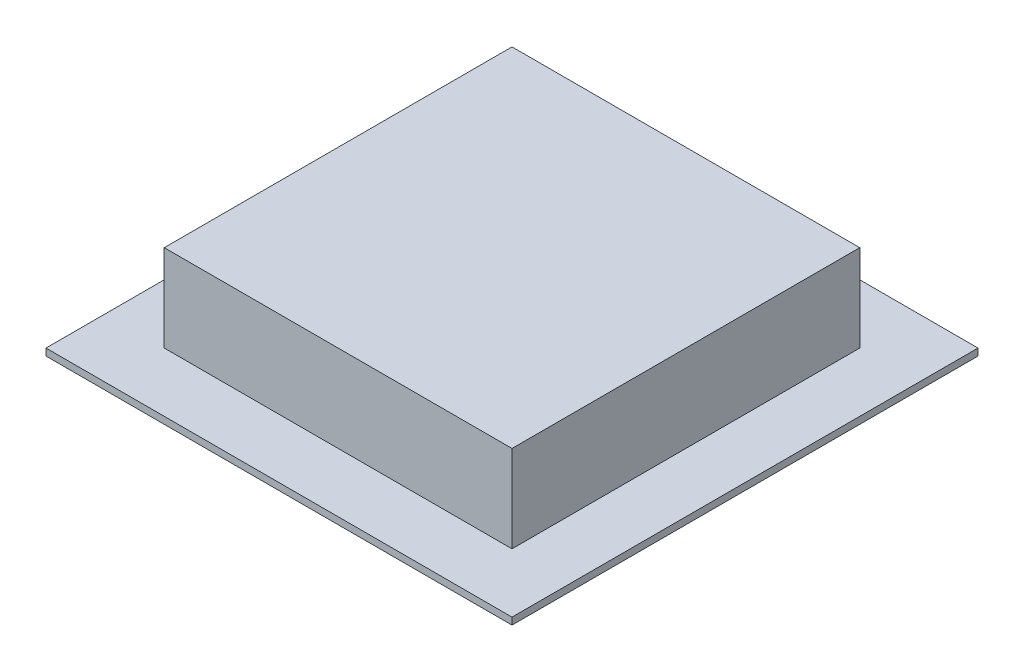
ISO-10303-21;
HEADER;
FILE_DESCRIPTION(('STEP AP214'),'2;1');
FILE_NAME('part.step','',(''),(''),'','','');
FILE_SCHEMA(('AUTOMOTIVE_DESIGN { 1 0 10303 214 1 1 1 1 }'));
ENDSEC;
DATA;
#1=APPLICATION_CONTEXT('core data for automotive mechanical design processes');
#2=APPLICATION_PROTOCOL_DEFINITION('international standard','automotive_design',2000,#1);
#3=PRODUCT_CONTEXT('',#1,'mechanical');
#4=PRODUCT('Part','Part','',(#3));
#5=PRODUCT_RELATED_PRODUCT_CATEGORY('part','',(#4));
#6=PRODUCT_DEFINITION_FORMATION('','',#4);
#7=PRODUCT_DEFINITION_CONTEXT('part definition',#1,'design');
#8=PRODUCT_DEFINITION('design','',#6,#7);
#9=PRODUCT_DEFINITION_SHAPE('','',#8);
#10=(LENGTH_UNIT() NAMED_UNIT(*) SI_UNIT(.MILLI.,.METRE.));
#11=(NAMED_UNIT(*) PLANE_ANGLE_UNIT() SI_UNIT($,.RADIAN.));
#12=(NAMED_UNIT(*) SI_UNIT($,.STERADIAN.) SOLID_ANGLE_UNIT());
#13=UNCERTAINTY_MEASURE_WITH_UNIT(LENGTH_MEASURE(1.E-05),#10,'distance_accuracy_value','');
#14=(GEOMETRIC_REPRESENTATION_CONTEXT(3) GLOBAL_UNCERTAINTY_ASSIGNED_CONTEXT((#13)) GLOBAL_UNIT_ASSIGNED_CONTEXT((#10,
#11,#12)) REPRESENTATION_CONTEXT('',''));
#15=CARTESIAN_POINT('',(0.,0.,0.));
#16=DIRECTION('',(0.,0.,1.));
#17=DIRECTION('',(1.,0.,0.));
#18=AXIS2_PLACEMENT_3D('',#15,#16,#17);
#19=CARTESIAN_POINT('',(-85.09,2.54,-85.09));
#20=DIRECTION('',(1.,0.,0.));
#21=DIRECTION('',(0.,0.,-1.));
#22=AXIS2_PLACEMENT_3D('',#19,#20,#21);
#23=PLANE('',#22);
#24=DIRECTION('',(0.,0.,1.));
#25=VECTOR('',#24,1.);
#26=CARTESIAN_POINT('',(-85.09,0.,-85.09));
#27=LINE('',#26,#25);
#28=CARTESIAN_POINT('',(-85.09,0.,-85.09));
#29=VERTEX_POINT('',#28);
#30=CARTESIAN_POINT('',(-85.09,0.,85.09));
#31=VERTEX_POINT('',#30);
#32=EDGE_CURVE('E126',#29,#31,#27,.T.);
#33=ORIENTED_EDGE('',*,*,#32,.T.);
#34=DIRECTION('',(0.,-1.,0.));
#35=VECTOR('',#34,1.);
#36=CARTESIAN_POINT('',(-85.09,2.54,85.09));
#37=LINE('',#36,#35);
#38=CARTESIAN_POINT('',(-85.09,2.54,85.09));
#39=VERTEX_POINT('',#38);
#40=EDGE_CURVE('E11',#39,#31,#37,.T.);
#41=ORIENTED_EDGE('',*,*,#40,.F.);
#42=DIRECTION('',(0.,0.,1.));
#43=VECTOR('',#42,1.);
#44=CARTESIAN_POINT('',(-85.09,2.54,-85.09));
#45=LINE('',#44,#43);
#46=CARTESIAN_POINT('',(-85.09,2.54,-85.09));
#47=VERTEX_POINT('',#46);
#48=EDGE_CURVE('E137',#47,#39,#45,.T.);
#49=ORIENTED_EDGE('',*,*,#48,.F.);
#50=DIRECTION('',(0.,-1.,0.));
#51=VECTOR('',#50,1.);
#52=CARTESIAN_POINT('',(-85.09,2.54,-85.09));
#53=LINE('',#52,#51);
#54=EDGE_CURVE('E150',#47,#29,#53,.T.);
#55=ORIENTED_EDGE('',*,*,#54,.T.);
#56=EDGE_LOOP('',(#33,#41,#49,#55));
#57=FACE_BOUND('',#56,.T.);
#58=ADVANCED_FACE('F38',(#57),#23,.F.);
#59=CARTESIAN_POINT('',(-85.09,2.54,85.09));
#60=DIRECTION('',(0.,0.,-1.));
#61=DIRECTION('',(-1.,0.,0.));
#62=AXIS2_PLACEMENT_3D('',#59,#60,#61);
#63=PLANE('',#62);
#64=DIRECTION('',(1.,0.,0.));
#65=VECTOR('',#64,1.);
#66=CARTESIAN_POINT('',(-85.09,0.,85.09));
#67=LINE('',#66,#65);
#68=CARTESIAN_POINT('',(85.09,0.,85.09));
#69=VERTEX_POINT('',#68);
#70=EDGE_CURVE('E131',#31,#69,#67,.T.);
#71=ORIENTED_EDGE('',*,*,#70,.T.);
#72=DIRECTION('',(0.,-1.,0.));
#73=VECTOR('',#72,1.);
#74=CARTESIAN_POINT('',(85.09,2.54,85.09));
#75=LINE('',#74,#73);
#76=CARTESIAN_POINT('',(85.09,2.54,85.09));
#77=VERTEX_POINT('',#76);
#78=EDGE_CURVE('E46',#77,#69,#75,.T.);
#79=ORIENTED_EDGE('',*,*,#78,.F.);
#80=DIRECTION('',(1.,0.,0.));
#81=VECTOR('',#80,1.);
#82=CARTESIAN_POINT('',(-85.09,2.54,85.09));
#83=LINE('',#82,#81);
#84=EDGE_CURVE('E141',#39,#77,#83,.T.);
#85=ORIENTED_EDGE('',*,*,#84,.F.);
#86=ORIENTED_EDGE('',*,*,#40,.T.);
#87=EDGE_LOOP('',(#71,#79,#85,#86));
#88=FACE_BOUND('',#87,.T.);
#89=ADVANCED_FACE('F187',(#88),#63,.F.);
#90=CARTESIAN_POINT('',(85.09,2.54,-85.09));
#91=DIRECTION('',(-1.,0.,0.));
#92=DIRECTION('',(0.,0.,1.));
#93=AXIS2_PLACEMENT_3D('',#90,#91,#92);
#94=PLANE('',#93);
#95=DIRECTION('',(0.,0.,-1.));
#96=VECTOR('',#95,1.);
#97=CARTESIAN_POINT('',(85.09,0.,-85.09));
#98=LINE('',#97,#96);
#99=CARTESIAN_POINT('',(85.09,0.,-85.09));
#100=VERTEX_POINT('',#99);
#101=EDGE_CURVE('E154',#69,#100,#98,.T.);
#102=ORIENTED_EDGE('',*,*,#101,.T.);
#103=DIRECTION('',(0.,-1.,0.));
#104=VECTOR('',#103,1.);
#105=CARTESIAN_POINT('',(85.09,2.54,-85.09));
#106=LINE('',#105,#104);
#107=CARTESIAN_POINT('',(85.09,2.54,-85.09));
#108=VERTEX_POINT('',#107);
#109=EDGE_CURVE('E162',#108,#100,#106,.T.);
#110=ORIENTED_EDGE('',*,*,#109,.F.);
#111=DIRECTION('',(0.,0.,-1.));
#112=VECTOR('',#111,1.);
#113=CARTESIAN_POINT('',(85.09,2.54,-85.09));
#114=LINE('',#113,#112);
#115=EDGE_CURVE('E145',#77,#108,#114,.T.);
#116=ORIENTED_EDGE('',*,*,#115,.F.);
#117=ORIENTED_EDGE('',*,*,#78,.T.);
#118=EDGE_LOOP('',(#102,#110,#116,#117));
#119=FACE_BOUND('',#118,.T.);
#120=ADVANCED_FACE('F171',(#119),#94,.F.);
#121=CARTESIAN_POINT('',(-85.09,2.54,-85.09));
#122=DIRECTION('',(0.,0.,1.));
#123=DIRECTION('',(1.,0.,0.));
#124=AXIS2_PLACEMENT_3D('',#121,#122,#123);
#125=PLANE('',#124);
#126=DIRECTION('',(-1.,0.,0.));
#127=VECTOR('',#126,1.);
#128=CARTESIAN_POINT('',(-85.09,0.,-85.09));
#129=LINE('',#128,#127);
#130=EDGE_CURVE('E142',#100,#29,#129,.T.);
#131=ORIENTED_EDGE('',*,*,#130,.T.);
#132=ORIENTED_EDGE('',*,*,#54,.F.);
#133=DIRECTION('',(-1.,0.,0.));
#134=VECTOR('',#133,1.);
#135=CARTESIAN_POINT('',(-85.09,2.54,-85.09));
#136=LINE('',#135,#134);
#137=EDGE_CURVE('E148',#108,#47,#136,.T.);
#138=ORIENTED_EDGE('',*,*,#137,.F.);
#139=ORIENTED_EDGE('',*,*,#109,.T.);
#140=EDGE_LOOP('',(#131,#132,#138,#139));
#141=FACE_BOUND('',#140,.T.);
#142=ADVANCED_FACE('F180',(#141),#125,.F.);
#143=CARTESIAN_POINT('',(0.,2.54,0.));
#144=DIRECTION('',(0.,1.,0.));
#145=DIRECTION('',(0.,0.,1.));
#146=AXIS2_PLACEMENT_3D('',#143,#144,#145);
#147=PLANE('',#146);
#148=CARTESIAN_POINT('',(-80.01,2.54,-78.74));
#149=DIRECTION('',(0.,1.,0.));
#150=DIRECTION('',(0.,0.,1.));
#151=AXIS2_PLACEMENT_3D('',#148,#149,#150);
#152=CIRCLE('',#151,2.);
#153=CARTESIAN_POINT('',(-80.01,2.54,-76.74));
#154=VERTEX_POINT('',#153);
#155=EDGE_CURVE('E225',#154,#154,#152,.T.);
#156=ORIENTED_EDGE('',*,*,#155,.F.);
#157=EDGE_LOOP('',(#156));
#158=FACE_BOUND('',#157,.T.);
#159=DIRECTION('',(0.,0.,1.));
#160=VECTOR('',#159,1.);
#161=CARTESIAN_POINT('',(-63.5,2.54,-63.5));
#162=LINE('',#161,#160);
#163=CARTESIAN_POINT('',(-63.5,2.54,-63.5));
#164=VERTEX_POINT('',#163);
#165=CARTESIAN_POINT('',(-63.5,2.54,63.5));
#166=VERTEX_POINT('',#165);
#167=EDGE_CURVE('E53',#164,#166,#162,.T.);
#168=ORIENTED_EDGE('',*,*,#167,.F.);
#169=DIRECTION('',(-1.,0.,0.));
#170=VECTOR('',#169,1.);
#171=CARTESIAN_POINT('',(-63.5,2.54,-63.5));
#172=LINE('',#171,#170);
#173=CARTESIAN_POINT('',(63.5,2.54,-63.5));
#174=VERTEX_POINT('',#173);
#175=EDGE_CURVE('E57',#174,#164,#172,.T.);
#176=ORIENTED_EDGE('',*,*,#175,.F.);
#177=DIRECTION('',(0.,0.,-1.));
#178=VECTOR('',#177,1.);
#179=CARTESIAN_POINT('',(63.5,2.54,-63.5));
#180=LINE('',#179,#178);
#181=CARTESIAN_POINT('',(63.5,2.54,63.5));
#182=VERTEX_POINT('',#181);
#183=EDGE_CURVE('E244',#182,#174,#180,.T.);
#184=ORIENTED_EDGE('',*,*,#183,.F.);
#185=DIRECTION('',(1.,0.,0.));
#186=VECTOR('',#185,1.);
#187=CARTESIAN_POINT('',(-63.5,2.54,63.5));
#188=LINE('',#187,#186);
#189=EDGE_CURVE('E233',#166,#182,#188,.T.);
#190=ORIENTED_EDGE('',*,*,#189,.F.);
#191=EDGE_LOOP('',(#168,#176,#184,#190));
#192=FACE_BOUND('',#191,.T.);
#193=ORIENTED_EDGE('',*,*,#48,.T.);
#194=ORIENTED_EDGE('',*,*,#84,.T.);
#195=ORIENTED_EDGE('',*,*,#115,.T.);
#196=ORIENTED_EDGE('',*,*,#137,.T.);
#197=EDGE_LOOP('',(#193,#194,#195,#196));
#198=FACE_BOUND('',#197,.T.);
#199=ADVANCED_FACE('F186',(#158,#192,#198),#147,.T.);
#200=CARTESIAN_POINT('',(0.,0.,0.));
#201=DIRECTION('',(0.,1.,0.));
#202=DIRECTION('',(0.,0.,1.));
#203=AXIS2_PLACEMENT_3D('',#200,#201,#202);
#204=PLANE('',#203);
#205=CARTESIAN_POINT('',(-80.01,0.,-78.74));
#206=DIRECTION('',(0.,1.,0.));
#207=DIRECTION('',(0.,0.,1.));
#208=AXIS2_PLACEMENT_3D('',#205,#206,#207);
#209=CIRCLE('',#208,2.);
#210=CARTESIAN_POINT('',(-80.01,0.,-76.74));
#211=VERTEX_POINT('',#210);
#212=EDGE_CURVE('E228',#211,#211,#209,.T.);
#213=ORIENTED_EDGE('',*,*,#212,.T.);
#214=EDGE_LOOP('',(#213));
#215=FACE_BOUND('',#214,.T.);
#216=ORIENTED_EDGE('',*,*,#32,.F.);
#217=ORIENTED_EDGE('',*,*,#130,.F.);
#218=ORIENTED_EDGE('',*,*,#101,.F.);
#219=ORIENTED_EDGE('',*,*,#70,.F.);
#220=EDGE_LOOP('',(#216,#217,#218,#219));
#221=FACE_BOUND('',#220,.T.);
#222=ADVANCED_FACE('F177',(#215,#221),#204,.F.);
#223=CARTESIAN_POINT('',(-63.5,34.29,-63.5));
#224=DIRECTION('',(1.,0.,0.));
#225=DIRECTION('',(0.,0.,-1.));
#226=AXIS2_PLACEMENT_3D('',#223,#224,#225);
#227=PLANE('',#226);
#228=ORIENTED_EDGE('',*,*,#167,.T.);
#229=DIRECTION('',(0.,-1.,0.));
#230=VECTOR('',#229,1.);
#231=CARTESIAN_POINT('',(-63.5,34.29,63.5));
#232=LINE('',#231,#230);
#233=CARTESIAN_POINT('',(-63.5,34.29,63.5));
#234=VERTEX_POINT('',#233);
#235=EDGE_CURVE('E106',#234,#166,#232,.T.);
#236=ORIENTED_EDGE('',*,*,#235,.F.);
#237=DIRECTION('',(0.,0.,1.));
#238=VECTOR('',#237,1.);
#239=CARTESIAN_POINT('',(-63.5,34.29,-63.5));
#240=LINE('',#239,#238);
#241=CARTESIAN_POINT('',(-63.5,34.29,-63.5));
#242=VERTEX_POINT('',#241);
#243=EDGE_CURVE('E113',#242,#234,#240,.T.);
#244=ORIENTED_EDGE('',*,*,#243,.F.);
#245=DIRECTION('',(0.,-1.,0.));
#246=VECTOR('',#245,1.);
#247=CARTESIAN_POINT('',(-63.5,34.29,-63.5));
#248=LINE('',#247,#246);
#249=EDGE_CURVE('E240',#242,#164,#248,.T.);
#250=ORIENTED_EDGE('',*,*,#249,.T.);
#251=EDGE_LOOP('',(#228,#236,#244,#250));
#252=FACE_BOUND('',#251,.T.);
#253=ADVANCED_FACE('F124',(#252),#227,.F.);
#254=CARTESIAN_POINT('',(-63.5,34.29,63.5));
#255=DIRECTION('',(0.,0.,-1.));
#256=DIRECTION('',(-1.,0.,0.));
#257=AXIS2_PLACEMENT_3D('',#254,#255,#256);
#258=PLANE('',#257);
#259=ORIENTED_EDGE('',*,*,#189,.T.);
#260=DIRECTION('',(0.,-1.,0.));
#261=VECTOR('',#260,1.);
#262=CARTESIAN_POINT('',(63.5,34.29,63.5));
#263=LINE('',#262,#261);
#264=CARTESIAN_POINT('',(63.5,34.29,63.5));
#265=VERTEX_POINT('',#264);
#266=EDGE_CURVE('E108',#265,#182,#263,.T.);
#267=ORIENTED_EDGE('',*,*,#266,.F.);
#268=DIRECTION('',(1.,0.,0.));
#269=VECTOR('',#268,1.);
#270=CARTESIAN_POINT('',(-63.5,34.29,63.5));
#271=LINE('',#270,#269);
#272=EDGE_CURVE('E101',#234,#265,#271,.T.);
#273=ORIENTED_EDGE('',*,*,#272,.F.);
#274=ORIENTED_EDGE('',*,*,#235,.T.);
#275=EDGE_LOOP('',(#259,#267,#273,#274));
#276=FACE_BOUND('',#275,.T.);
#277=ADVANCED_FACE('F104',(#276),#258,.F.);
#278=CARTESIAN_POINT('',(63.5,34.29,-63.5));
#279=DIRECTION('',(-1.,0.,0.));
#280=DIRECTION('',(0.,0.,1.));
#281=AXIS2_PLACEMENT_3D('',#278,#279,#280);
#282=PLANE('',#281);
#283=ORIENTED_EDGE('',*,*,#183,.T.);
#284=DIRECTION('',(0.,-1.,0.));
#285=VECTOR('',#284,1.);
#286=CARTESIAN_POINT('',(63.5,34.29,-63.5));
#287=LINE('',#286,#285);
#288=CARTESIAN_POINT('',(63.5,34.29,-63.5));
#289=VERTEX_POINT('',#288);
#290=EDGE_CURVE('E133',#289,#174,#287,.T.);
#291=ORIENTED_EDGE('',*,*,#290,.F.);
#292=DIRECTION('',(0.,0.,-1.));
#293=VECTOR('',#292,1.);
#294=CARTESIAN_POINT('',(63.5,34.29,-63.5));
#295=LINE('',#294,#293);
#296=EDGE_CURVE('E112',#265,#289,#295,.T.);
#297=ORIENTED_EDGE('',*,*,#296,.F.);
#298=ORIENTED_EDGE('',*,*,#266,.T.);
#299=EDGE_LOOP('',(#283,#291,#297,#298));
#300=FACE_BOUND('',#299,.T.);
#301=ADVANCED_FACE('F207',(#300),#282,.F.);
#302=CARTESIAN_POINT('',(-63.5,34.29,-63.5));
#303=DIRECTION('',(0.,0.,1.));
#304=DIRECTION('',(1.,0.,0.));
#305=AXIS2_PLACEMENT_3D('',#302,#303,#304);
#306=PLANE('',#305);
#307=ORIENTED_EDGE('',*,*,#175,.T.);
#308=ORIENTED_EDGE('',*,*,#249,.F.);
#309=DIRECTION('',(-1.,0.,0.));
#310=VECTOR('',#309,1.);
#311=CARTESIAN_POINT('',(-63.5,34.29,-63.5));
#312=LINE('',#311,#310);
#313=EDGE_CURVE('E118',#289,#242,#312,.T.);
#314=ORIENTED_EDGE('',*,*,#313,.F.);
#315=ORIENTED_EDGE('',*,*,#290,.T.);
#316=EDGE_LOOP('',(#307,#308,#314,#315));
#317=FACE_BOUND('',#316,.T.);
#318=ADVANCED_FACE('F210',(#317),#306,.F.);
#319=CARTESIAN_POINT('',(0.,34.29,0.));
#320=DIRECTION('',(0.,1.,0.));
#321=DIRECTION('',(0.,0.,1.));
#322=AXIS2_PLACEMENT_3D('',#319,#320,#321);
#323=PLANE('',#322);
#324=ORIENTED_EDGE('',*,*,#243,.T.);
#325=ORIENTED_EDGE('',*,*,#272,.T.);
#326=ORIENTED_EDGE('',*,*,#296,.T.);
#327=ORIENTED_EDGE('',*,*,#313,.T.);
#328=EDGE_LOOP('',(#324,#325,#326,#327));
#329=FACE_BOUND('',#328,.T.);
#330=ADVANCED_FACE('F116',(#329),#323,.T.);
#331=CARTESIAN_POINT('',(-80.01,2.54,-78.74));
#332=DIRECTION('',(0.,1.,0.));
#333=DIRECTION('',(0.,0.,1.));
#334=AXIS2_PLACEMENT_3D('',#331,#332,#333);
#335=CYLINDRICAL_SURFACE('',#334,2.);
#336=ORIENTED_EDGE('',*,*,#155,.T.);
#337=EDGE_LOOP('',(#336));
#338=FACE_BOUND('',#337,.T.);
#339=ORIENTED_EDGE('',*,*,#212,.F.);
#340=EDGE_LOOP('',(#339));
#341=FACE_BOUND('',#340,.T.);
#342=ADVANCED_FACE('F217',(#338,#341),#335,.F.);
#343=CLOSED_SHELL('',(#58,#89,#120,#142,#199,#222,#253,#277,#301,#318,#330,#342));
#344=MANIFOLD_SOLID_BREP('B2',#343);
#345=ADVANCED_BREP_SHAPE_REPRESENTATION('',(#18,#344),#14);
#346=SHAPE_DEFINITION_REPRESENTATION(#9,#345);
ENDSEC;
END-ISO-10303-21;
